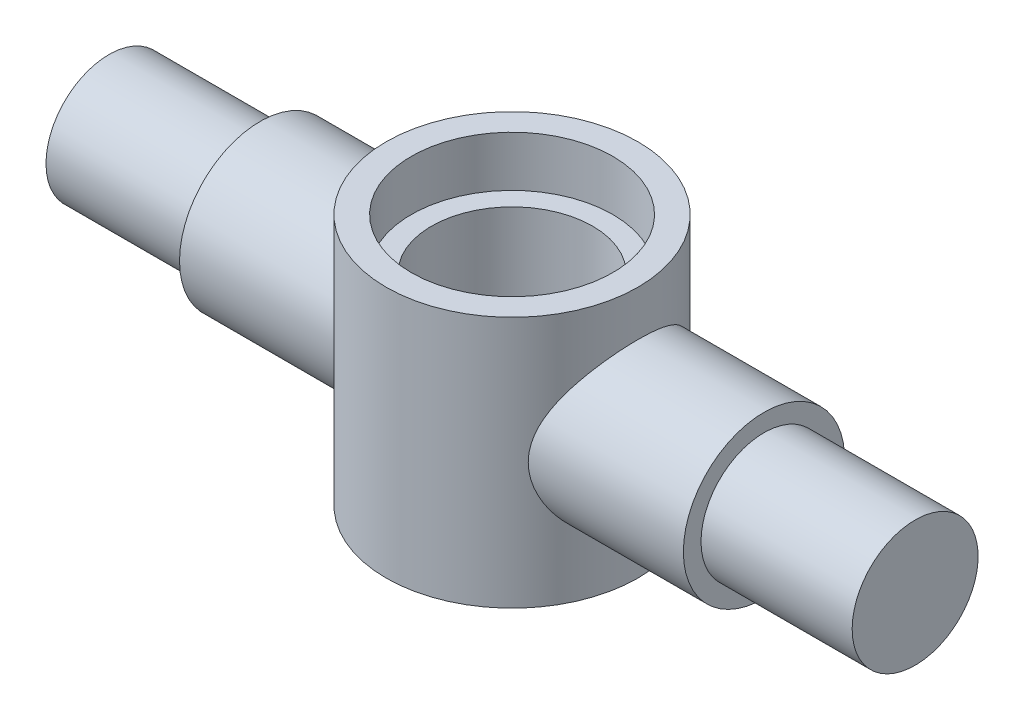
ISO-10303-21;
HEADER;
FILE_DESCRIPTION(('STEP AP214'),'2;1');
FILE_NAME('part.step','',(''),(''),'','','');
FILE_SCHEMA(('AUTOMOTIVE_DESIGN { 1 0 10303 214 1 1 1 1 }'));
ENDSEC;
DATA;
#1=APPLICATION_CONTEXT('core data for automotive mechanical design processes');
#2=APPLICATION_PROTOCOL_DEFINITION('international standard','automotive_design',2000,#1);
#3=PRODUCT_CONTEXT('',#1,'mechanical');
#4=PRODUCT('Part','Part','',(#3));
#5=PRODUCT_RELATED_PRODUCT_CATEGORY('part','',(#4));
#6=PRODUCT_DEFINITION_FORMATION('','',#4);
#7=PRODUCT_DEFINITION_CONTEXT('part definition',#1,'design');
#8=PRODUCT_DEFINITION('design','',#6,#7);
#9=PRODUCT_DEFINITION_SHAPE('','',#8);
#10=(LENGTH_UNIT() NAMED_UNIT(*) SI_UNIT(.MILLI.,.METRE.));
#11=(NAMED_UNIT(*) PLANE_ANGLE_UNIT() SI_UNIT($,.RADIAN.));
#12=(NAMED_UNIT(*) SI_UNIT($,.STERADIAN.) SOLID_ANGLE_UNIT());
#13=UNCERTAINTY_MEASURE_WITH_UNIT(LENGTH_MEASURE(1.E-05),#10,'distance_accuracy_value','');
#14=(GEOMETRIC_REPRESENTATION_CONTEXT(3) GLOBAL_UNCERTAINTY_ASSIGNED_CONTEXT((#13)) GLOBAL_UNIT_ASSIGNED_CONTEXT((#10,
#11,#12)) REPRESENTATION_CONTEXT('',''));
#15=CARTESIAN_POINT('',(0.,0.,0.));
#16=DIRECTION('',(0.,0.,1.));
#17=DIRECTION('',(1.,0.,0.));
#18=AXIS2_PLACEMENT_3D('',#15,#16,#17);
#19=CARTESIAN_POINT('',(0.,25.,0.));
#20=DIRECTION('',(0.,1.,0.));
#21=DIRECTION('',(-1.,0.,0.));
#22=AXIS2_PLACEMENT_3D('',#19,#20,#21);
#23=CYLINDRICAL_SURFACE('',#22,25.);
#24=CARTESIAN_POINT('',(0.,25.,0.));
#25=DIRECTION('',(0.,1.,0.));
#26=DIRECTION('',(-1.,0.,0.));
#27=AXIS2_PLACEMENT_3D('',#24,#25,#26);
#28=CIRCLE('',#27,25.);
#29=CARTESIAN_POINT('',(-25.,25.,0.));
#30=VERTEX_POINT('',#29);
#31=EDGE_CURVE('E57',#30,#30,#28,.T.);
#32=ORIENTED_EDGE('',*,*,#31,.F.);
#33=EDGE_LOOP('',(#32));
#34=FACE_BOUND('',#33,.T.);
#35=CARTESIAN_POINT('',(0.,-25.,0.));
#36=DIRECTION('',(0.,1.,0.));
#37=DIRECTION('',(-1.,0.,0.));
#38=AXIS2_PLACEMENT_3D('',#35,#36,#37);
#39=CIRCLE('',#38,25.);
#40=CARTESIAN_POINT('',(-25.,-25.,0.));
#41=VERTEX_POINT('',#40);
#42=EDGE_CURVE('E55',#41,#41,#39,.T.);
#43=ORIENTED_EDGE('',*,*,#42,.T.);
#44=EDGE_LOOP('',(#43));
#45=FACE_BOUND('',#44,.T.);
#46=CARTESIAN_POINT('',(19.2093727122986,0.,16.));
#47=CARTESIAN_POINT('',(19.2093602004703,-0.395450741818392,16.0000075518309));
#48=CARTESIAN_POINT('',(19.2216281701415,-0.790830022740218,15.985318558414));
#49=CARTESIAN_POINT('',(19.2700828129892,-1.57809681292205,15.9268763773465));
#50=CARTESIAN_POINT('',(19.3062771873145,-1.96998315674333,15.8831138318214));
#51=CARTESIAN_POINT('',(19.4010060093012,-2.74740735451356,15.7672610060305));
#52=CARTESIAN_POINT('',(19.4595765701312,-3.13293388953269,15.695124927821));
#53=CARTESIAN_POINT('',(19.5965538328848,-3.89425061412518,15.5237584274562));
#54=CARTESIAN_POINT('',(19.6749599547327,-4.27004108806787,15.424528797624));
#55=CARTESIAN_POINT('',(19.8478677138077,-5.00648391302579,15.2013768268568));
#56=CARTESIAN_POINT('',(19.9422183799563,-5.36724195350467,15.0776843957441));
#57=CARTESIAN_POINT('',(20.144463471884,-6.07574987096303,14.80639059605));
#58=CARTESIAN_POINT('',(20.2523599296603,-6.42349778612012,14.6587856393959));
#59=CARTESIAN_POINT('',(20.4786703313642,-7.10487336943405,14.34092425358));
#60=CARTESIAN_POINT('',(20.5970838421642,-7.43850161825142,14.1706687570999));
#61=CARTESIAN_POINT('',(20.8415708471704,-8.09089316911373,13.8085717175924));
#62=CARTESIAN_POINT('',(20.9676448352994,-8.40965551030582,13.6167287819958));
#63=CARTESIAN_POINT('',(21.2429784742916,-9.07571937888856,13.183726884198));
#64=CARTESIAN_POINT('',(21.3929937414825,-9.42067256852973,12.9394311786344));
#65=CARTESIAN_POINT('',(21.6958102059326,-10.089453664192,12.4250119334488));
#66=CARTESIAN_POINT('',(21.8486115820407,-10.4132802078776,12.1548867309956));
#67=CARTESIAN_POINT('',(22.153690243193,-11.0390522050632,11.5895322792664));
#68=CARTESIAN_POINT('',(22.3059669935383,-11.3409794346957,11.2942825562918));
#69=CARTESIAN_POINT('',(22.6066292638259,-11.9214646022861,10.6797634395583));
#70=CARTESIAN_POINT('',(22.7550145449759,-12.2000211084417,10.3604925764188));
#71=CARTESIAN_POINT('',(23.0635047016872,-12.7667075937182,9.65613685196289));
#72=CARTESIAN_POINT('',(23.2226498605155,-13.0514317810644,9.26787638476106));
#73=CARTESIAN_POINT('',(23.5277165227615,-13.5868256125372,8.46354327157017));
#74=CARTESIAN_POINT('',(23.6736365980179,-13.8374915802119,8.04746763026313));
#75=CARTESIAN_POINT('',(23.9479803876146,-14.3017764357153,7.19003859126285));
#76=CARTESIAN_POINT('',(24.0764176374088,-14.5154240190881,6.74870512893473));
#77=CARTESIAN_POINT('',(24.3119879120981,-14.9029000599008,5.84344355319202));
#78=CARTESIAN_POINT('',(24.4191250484791,-15.076736202989,5.37951982186268));
#79=CARTESIAN_POINT('',(24.5985926447152,-15.3656160862095,4.48282903672906));
#80=CARTESIAN_POINT('',(24.6734013192139,-15.4849249997567,4.05193075208175));
#81=CARTESIAN_POINT('',(24.801040881362,-15.6875056250082,3.17853043332121));
#82=CARTESIAN_POINT('',(24.8538731689283,-15.7707796321842,2.73602914024028));
#83=CARTESIAN_POINT('',(24.9359332327917,-15.8997874849552,1.84383752201983));
#84=CARTESIAN_POINT('',(24.9651830643106,-15.9455564074084,1.39415431610934));
#85=CARTESIAN_POINT('',(24.9992426632787,-15.9988302400714,0.491624497686972));
#86=CARTESIAN_POINT('',(25.0040554585505,-16.0063398907209,0.0387782840441615));
#87=CARTESIAN_POINT('',(24.9901621157745,-15.9846245464524,-0.801807020258263));
#88=CARTESIAN_POINT('',(24.9746698897481,-15.9604195679006,-1.18974170793274));
#89=CARTESIAN_POINT('',(24.925916743737,-15.8840233753194,-1.96167918510344));
#90=CARTESIAN_POINT('',(24.8926579243074,-15.8318354697257,-2.34568243394718));
#91=CARTESIAN_POINT('',(24.809124943467,-15.7001676417372,-3.10709482157081));
#92=CARTESIAN_POINT('',(24.7588500773314,-15.6206865889864,-3.48450368656139));
#93=CARTESIAN_POINT('',(24.6423835379047,-15.4354220324528,-4.23029490411503));
#94=CARTESIAN_POINT('',(24.5761911870475,-15.3296374089885,-4.59867687169073));
#95=CARTESIAN_POINT('',(24.429246979534,-15.09293595188,-5.3243786114757));
#96=CARTESIAN_POINT('',(24.3484911868781,-14.9620123234025,-5.68169536247057));
#97=CARTESIAN_POINT('',(24.1740178828328,-14.6763730310704,-6.38338290414123));
#98=CARTESIAN_POINT('',(24.0803005538868,-14.5216577020982,-6.72775387695178));
#99=CARTESIAN_POINT('',(23.88162522246,-14.1897742394937,-7.40213203498125));
#100=CARTESIAN_POINT('',(23.7766665635656,-14.0126047945902,-7.73213837982413));
#101=CARTESIAN_POINT('',(23.5573305378522,-13.6371200068658,-8.37663930224959));
#102=CARTESIAN_POINT('',(23.4429521112619,-13.4388022840152,-8.69113212810155));
#103=CARTESIAN_POINT('',(23.1916461498523,-12.9957628822917,-9.34261350029824));
#104=CARTESIAN_POINT('',(23.0537005367941,-12.7483470877916,-9.67737906939421));
#105=CARTESIAN_POINT('',(22.7710425195163,-12.2297848715424,-10.3249438913943));
#106=CARTESIAN_POINT('',(22.6263296265049,-11.9586367344007,-10.6377415534904));
#107=CARTESIAN_POINT('',(22.3328215884758,-11.3935639779315,-11.2408946521999));
#108=CARTESIAN_POINT('',(22.1840210043112,-11.0996079572823,-11.5312180082151));
#109=CARTESIAN_POINT('',(21.8855595984986,-10.4903882100913,-12.0880975088665));
#110=CARTESIAN_POINT('',(21.7358987343383,-10.1751234221084,-12.3546524680054));
#111=CARTESIAN_POINT('',(21.4181651432605,-9.47875337366145,-12.8986334479259));
#112=CARTESIAN_POINT('',(21.2504398360994,-9.09460175903956,-13.1723794101635));
#113=CARTESIAN_POINT('',(20.9231280377543,-8.30108239529781,-13.6863281692123));
#114=CARTESIAN_POINT('',(20.7635431930463,-7.89170958165702,-13.9265241972136));
#115=CARTESIAN_POINT('',(20.4583462502362,-7.04964812228662,-14.3711052241852));
#116=CARTESIAN_POINT('',(20.3127140688785,-6.61699443242505,-14.5755420556062));
#117=CARTESIAN_POINT('',(20.1091927064436,-5.95182141302221,-14.8537397354869));
#118=CARTESIAN_POINT('',(20.043847548657,-5.72742835996076,-14.9417198388729));
#119=CARTESIAN_POINT('',(19.9188677051514,-5.27341753747447,-15.107928903543));
#120=CARTESIAN_POINT('',(19.8592344402921,-5.04379848554791,-15.1861554400349));
#121=CARTESIAN_POINT('',(19.720753651965,-4.47386707312211,-15.3658713186935));
#122=CARTESIAN_POINT('',(19.645552574875,-4.13084777878346,-15.4616911152538));
#123=CARTESIAN_POINT('',(19.5113255727846,-3.43625908207936,-15.6307339070693));
#124=CARTESIAN_POINT('',(19.4522955441896,-3.08469187354872,-15.7039626356712));
#125=CARTESIAN_POINT('',(19.3524938058948,-2.37531516224826,-15.8267893922012));
#126=CARTESIAN_POINT('',(19.3116995928932,-2.01751392232936,-15.8764165497243));
#127=CARTESIAN_POINT('',(19.24981462822,-1.29766012634529,-15.9513955181358));
#128=CARTESIAN_POINT('',(19.2287241117882,-0.935607519575856,-15.9767470392006));
#129=CARTESIAN_POINT('',(19.2070655710884,-0.208914040156353,-16.0027787782538));
#130=CARTESIAN_POINT('',(19.2065587736387,0.155731327892919,-16.0033853918814));
#131=CARTESIAN_POINT('',(19.2262437044411,0.883646492477324,-15.9797303685735));
#132=CARTESIAN_POINT('',(19.2464355421881,1.2469162817255,-15.9554686000853));
#133=CARTESIAN_POINT('',(19.3067193481981,1.96956504405772,-15.8824686441804));
#134=CARTESIAN_POINT('',(19.3468257479805,2.32894100212412,-15.8337127062304));
#135=CARTESIAN_POINT('',(19.4454047345737,3.04108188334853,-15.7124891921192));
#136=CARTESIAN_POINT('',(19.5038777302889,3.39384665913328,-15.640021088041));
#137=CARTESIAN_POINT('',(19.6353070822549,4.08117003267904,-15.4746735603332));
#138=CARTESIAN_POINT('',(19.7078206333577,4.41596250211351,-15.3824106552207));
#139=CARTESIAN_POINT('',(19.8661366285732,5.07603904878438,-15.1773980264134));
#140=CARTESIAN_POINT('',(19.9519442856407,5.4013193363182,-15.0646402631501));
#141=CARTESIAN_POINT('',(20.2259366590945,6.36115702066662,-14.6970969552363));
#142=CARTESIAN_POINT('',(20.4307664709313,6.98008445692647,-14.4129501324544));
#143=CARTESIAN_POINT('',(20.7791231934689,7.92978311110474,-13.9025759153207));
#144=CARTESIAN_POINT('',(20.9141789774944,8.27634446914637,-13.6990065677717));
#145=CARTESIAN_POINT('',(21.1904755475319,8.95159599548267,-13.2676036626528));
#146=CARTESIAN_POINT('',(21.331716916245,9.28028447353068,-13.0397678161961));
#147=CARTESIAN_POINT('',(21.617328622136,9.91920804166725,-12.5606127955534));
#148=CARTESIAN_POINT('',(21.7617021658762,10.2294228728555,-12.3092685900815));
#149=CARTESIAN_POINT('',(22.0504950386983,10.83022156592,-11.7841200489597));
#150=CARTESIAN_POINT('',(22.1949143700021,11.1208042527167,-11.5103143710492));
#151=CARTESIAN_POINT('',(22.5068806894766,11.7320378290204,-10.8895251971102));
#152=CARTESIAN_POINT('',(22.6738912555057,12.0486339518646,-10.538258852383));
#153=CARTESIAN_POINT('',(22.9997454081353,12.6511856036189,-9.80673841828235));
#154=CARTESIAN_POINT('',(23.1585876314467,12.9371360263668,-9.42647951620011));
#155=CARTESIAN_POINT('',(23.4637861759484,13.4758482705846,-8.63879825507576));
#156=CARTESIAN_POINT('',(23.6101533508035,13.7286390473383,-8.23140006944533));
#157=CARTESIAN_POINT('',(23.8173475602848,14.0810166740321,-7.60150490333189));
#158=CARTESIAN_POINT('',(23.8843490627493,14.1940015577088,-7.38842079738172));
#159=CARTESIAN_POINT('',(24.0137961299491,14.4107587612229,-6.95618401063908));
#160=CARTESIAN_POINT('',(24.0762405186914,14.5145287045722,-6.73702978339917));
#161=CARTESIAN_POINT('',(24.2320055848663,14.7717973408357,-6.15995796925272));
#162=CARTESIAN_POINT('',(24.321400053688,14.9178236369807,-5.79759896313244));
#163=CARTESIAN_POINT('',(24.4854315282584,15.1837844441139,-5.06026412930272));
#164=CARTESIAN_POINT('',(24.5600711973214,15.3037236643405,-4.6852905929035));
#165=CARTESIAN_POINT('',(24.6929742121903,15.5161154342713,-3.92502403877744));
#166=CARTESIAN_POINT('',(24.7512476771231,15.6085849703694,-3.53973755962496));
#167=CARTESIAN_POINT('',(24.8501510392655,15.7649509257018,-2.76115486747052));
#168=CARTESIAN_POINT('',(24.8907806004012,15.8288468006774,-2.36785850204886));
#169=CARTESIAN_POINT('',(24.9535312925749,15.9273404409633,-1.57480221577731));
#170=CARTESIAN_POINT('',(24.9755905708137,15.9618403003625,-1.17502517982107));
#171=CARTESIAN_POINT('',(25.0004272981601,16.0006746513738,-0.373405625880842));
#172=CARTESIAN_POINT('',(25.0032047459269,16.0050091408883,0.0284368922467695));
#173=CARTESIAN_POINT('',(24.9894083698085,15.9834476229949,0.831001220465051));
#174=CARTESIAN_POINT('',(24.9728331376842,15.9575494156401,1.23172294687188));
#175=CARTESIAN_POINT('',(24.9207400616191,15.8759022758455,2.02885267808105));
#176=CARTESIAN_POINT('',(24.8852226810495,15.8201540736094,2.42526078816295));
#177=CARTESIAN_POINT('',(24.7984189745796,15.68324665588,3.19044626417198));
#178=CARTESIAN_POINT('',(24.7480444224836,15.6035527406556,3.55959149260969));
#179=CARTESIAN_POINT('',(24.6320994030311,15.4189971904594,4.28906417390255));
#180=CARTESIAN_POINT('',(24.5665295814812,15.3141366250765,4.64939200078243));
#181=CARTESIAN_POINT('',(24.4214925565386,15.0803746063925,5.35928858254075));
#182=CARTESIAN_POINT('',(24.3420245415617,14.9514717491141,5.70885670770437));
#183=CARTESIAN_POINT('',(24.170683642612,14.6708653525123,6.39556994704414));
#184=CARTESIAN_POINT('',(24.0788100748657,14.5191605563319,6.73271437514203));
#185=CARTESIAN_POINT('',(23.8769190367743,14.1819204834617,7.41821218958759));
#186=CARTESIAN_POINT('',(23.7660547293117,13.9946940329281,7.76548374262893));
#187=CARTESIAN_POINT('',(23.533987358231,13.5968623110591,8.44272462594597));
#188=CARTESIAN_POINT('',(23.4127838763452,13.3862560937994,8.77269325536516));
#189=CARTESIAN_POINT('',(23.1621773907135,12.942948547228,9.41447208281313));
#190=CARTESIAN_POINT('',(23.0327692434887,12.7102333113594,9.72627065030755));
#191=CARTESIAN_POINT('',(22.7681033449974,12.224078988506,10.3306501038477));
#192=CARTESIAN_POINT('',(22.6328450147247,11.9706378480088,10.6232290804345));
#193=CARTESIAN_POINT('',(22.3378986081481,11.4038990021542,11.2316218874087));
#194=CARTESIAN_POINT('',(22.1776354019021,11.0873722519175,11.5441559130474));
#195=CARTESIAN_POINT('',(21.8562350326654,10.4296383547697,12.1416680025961));
#196=CARTESIAN_POINT('',(21.6950977427163,10.0884275286712,12.4266419437925));
#197=CARTESIAN_POINT('',(21.375928274595,9.38240404588212,12.9679779160604));
#198=CARTESIAN_POINT('',(21.2178973024897,9.01758244911156,13.2243290079454));
#199=CARTESIAN_POINT('',(20.9093760040417,8.26556414666312,13.7069324509098));
#200=CARTESIAN_POINT('',(20.7588843294594,7.87837146842733,13.933190195594));
#201=CARTESIAN_POINT('',(20.4904053646846,7.13850609897017,14.3245055255624));
#202=CARTESIAN_POINT('',(20.3708181994352,6.78859802866814,14.4936962326903));
#203=CARTESIAN_POINT('',(20.1439415106924,6.07397381223701,14.8074000887338));
#204=CARTESIAN_POINT('',(20.0366521382654,5.70925748427749,14.9519129345167));
#205=CARTESIAN_POINT('',(19.837970972326,4.96714496507767,15.2145325262258));
#206=CARTESIAN_POINT('',(19.7465442856356,4.58977884054347,15.3326973975323));
#207=CARTESIAN_POINT('',(19.5826454523432,3.82361318584246,15.5414800751121));
#208=CARTESIAN_POINT('',(19.5101663424499,3.43481791452257,15.6321080032873));
#209=CARTESIAN_POINT('',(19.3709744142914,2.54459093114954,15.8044576067829));
#210=CARTESIAN_POINT('',(19.3107841815136,2.04041323215055,15.8775776488039));
#211=CARTESIAN_POINT('',(19.2299909394771,1.02411722304983,15.9753445575078));
#212=CARTESIAN_POINT('',(19.209388911636,0.51199871640755,15.9999902224795));
#213=CARTESIAN_POINT('',(19.2093727122986,0.,16.));
#214=B_SPLINE_CURVE_WITH_KNOTS('',3,(#46,#47,#48,#49,#50,#51,#52,#53,#54,#55,#56,#57,#58,#59,
#60,#61,#62,#63,#64,#65,#66,#67,#68,#69,#70,#71,#72,#73,#74,#75,#76,#77,#78,#79,#80,#81,#82,#83,
#84,#85,#86,#87,#88,#89,#90,#91,#92,#93,#94,#95,#96,#97,#98,#99,#100,#101,#102,#103,#104,#105,
#106,#107,#108,#109,#110,#111,#112,#113,#114,#115,#116,#117,#118,#119,#120,#121,#122,#123,#124,
#125,#126,#127,#128,#129,#130,#131,#132,#133,#134,#135,#136,#137,#138,#139,#140,#141,#142,#143,
#144,#145,#146,#147,#148,#149,#150,#151,#152,#153,#154,#155,#156,#157,#158,#159,#160,#161,#162,
#163,#164,#165,#166,#167,#168,#169,#170,#171,#172,#173,#174,#175,#176,#177,#178,#179,#180,#181,
#182,#183,#184,#185,#186,#187,#188,#189,#190,#191,#192,#193,#194,#195,#196,#197,#198,#199,#200,
#201,#202,#203,#204,#205,#206,#207,#208,#209,#210,#211,#212,#213),.UNSPECIFIED.,.T.,.F.,(4,2,2,
2,2,2,2,2,2,2,2,2,2,2,2,2,2,2,2,2,2,2,2,2,2,2,2,2,2,2,2,2,2,2,2,2,2,2,2,2,2,2,2,2,2,2,2,2,2,2,2,
2,2,2,2,2,2,2,2,2,2,2,2,2,2,2,2,2,2,2,2,2,2,2,2,2,2,2,2,2,2,2,2,4),(0.,1.18577451563378,
2.3719308803307,3.56000973844409,4.74805385612807,5.92542182765323,7.10296662705879,
8.28046295368245,9.45803528219828,10.8023160446125,12.1466834064257,13.4921569662333,
14.8377128960858,16.3569602143826,17.876371399424,19.3945994612359,20.9125341796885,
22.2705040937009,23.6283874904698,24.9849994644068,26.3414433459186,27.5070310105171,
28.6724808974645,29.8379790577811,31.0035268391193,32.1693901015006,33.3352369551525,
34.5011519231031,35.6671982420161,36.981484304163,38.2958654425361,39.6120894425729,
40.9283790552946,42.4284846788318,43.9288925178197,45.4271071822749,46.1760210388417,
46.9251207099888,48.0159853843354,49.1065729819124,50.1958110356673,51.2850620935235,
52.3775529210133,53.4700495277667,54.5633389938717,55.6566528021364,56.7198824116749,
57.783530000594,59.909660789382,61.1808078676574,62.4520749505808,63.7247114101544,
64.9974239758646,66.5001130296407,68.0030520722832,69.5046698733184,70.2553847672214,
71.0062927079441,72.2072677819863,73.408025875761,74.6080399052386,75.8080767910933,
77.0120950499147,78.2161133924544,79.4202193534208,80.6242958603644,81.766023444616,
82.9077025137561,84.0494482734539,85.1912569899845,86.4194532766275,87.6476992731069,
88.8767230159271,90.105868677688,91.5228092826638,92.9399615210125,94.357653531239,
95.7750911063543,96.9939255712751,98.2127750067778,99.4289083750166,100.644594180297,
102.179804297619,103.715052473312),.UNSPECIFIED.);
#215=CARTESIAN_POINT('',(19.2093727122986,0.,16.));
#216=VERTEX_POINT('',#215);
#217=EDGE_CURVE('E48',#216,#216,#214,.T.);
#218=ORIENTED_EDGE('',*,*,#217,.F.);
#219=EDGE_LOOP('',(#218));
#220=FACE_BOUND('',#219,.T.);
#221=CARTESIAN_POINT('',(-25.,-16.,0.));
#222=CARTESIAN_POINT('',(-25.0000015619882,-16.0000018773157,0.404925044071176));
#223=CARTESIAN_POINT('',(-24.990142097665,-15.9846099706385,0.809832411815946));
#224=CARTESIAN_POINT('',(-24.9509510419688,-15.92326968288,1.61652618236302));
#225=CARTESIAN_POINT('',(-24.9216122625561,-15.8773100220158,2.01831137766447));
#226=CARTESIAN_POINT('',(-24.8441286420605,-15.7554098701401,2.81604821037115));
#227=CARTESIAN_POINT('',(-24.7959565811092,-15.6794259832054,3.2119905395922));
#228=CARTESIAN_POINT('',(-24.6819740036757,-15.4985408355827,3.99456099671031));
#229=CARTESIAN_POINT('',(-24.6161648797958,-15.3936418579784,4.38118985736236));
#230=CARTESIAN_POINT('',(-24.468785547579,-15.1568468243231,5.1407660907412));
#231=CARTESIAN_POINT('',(-24.3872961899422,-15.025089059471,5.51377244407855));
#232=CARTESIAN_POINT('',(-24.2100855842812,-14.7357159583602,6.24609510158278));
#233=CARTESIAN_POINT('',(-24.114364104839,-14.5781002016396,6.60541118302289));
#234=CARTESIAN_POINT('',(-23.9106324755014,-14.2385667901493,7.30859986653981));
#235=CARTESIAN_POINT('',(-23.8026253610819,-14.0566551363675,7.65247625422318));
#236=CARTESIAN_POINT('',(-23.5763254629354,-13.6699562899151,8.32360019852908));
#237=CARTESIAN_POINT('',(-23.4580313681202,-13.4651661804077,8.65084562706961));
#238=CARTESIAN_POINT('',(-23.2032751229575,-13.0164828623738,9.31365412183655));
#239=CARTESIAN_POINT('',(-23.0661182340287,-12.7707619235136,9.64771274316308));
#240=CARTESIAN_POINT('',(-22.7850064089794,-12.2557366535805,10.2940617258667));
#241=CARTESIAN_POINT('',(-22.6410511668713,-11.9864312605261,10.6063511058609));
#242=CARTESIAN_POINT('',(-22.3490022897849,-11.4252092234652,11.2086687230747));
#243=CARTESIAN_POINT('',(-22.2009034973146,-11.1332635184821,11.4986673651025));
#244=CARTESIAN_POINT('',(-21.9037344054836,-10.5282019106555,12.0551203444099));
#245=CARTESIAN_POINT('',(-21.7546640715094,-10.2150852497817,12.3215738378621));
#246=CARTESIAN_POINT('',(-21.4374499122155,-9.52219977657806,12.8665793254927));
#247=CARTESIAN_POINT('',(-21.2696389657507,-9.1393143835168,13.1413799496497));
#248=CARTESIAN_POINT('',(-20.9419379170098,-8.348316185452,13.6575524379486));
#249=CARTESIAN_POINT('',(-20.7820494133894,-7.94019832587866,13.8989175727052));
#250=CARTESIAN_POINT('',(-20.4759821659353,-7.10058524689527,14.3459904698911));
#251=CARTESIAN_POINT('',(-20.3297848843603,-6.66912292284908,14.5517467761611));
#252=CARTESIAN_POINT('',(-20.1252100289451,-6.00569055390515,14.8320367864773));
#253=CARTESIAN_POINT('',(-20.0594794225192,-5.78186975362471,14.9207331379766));
#254=CARTESIAN_POINT('',(-19.9336577942813,-5.3289818989008,15.0884150598226));
#255=CARTESIAN_POINT('',(-19.8735682005867,-5.09991353411016,15.16739817266));
#256=CARTESIAN_POINT('',(-19.7336948385013,-4.53055229253545,15.3492623867947));
#257=CARTESIAN_POINT('',(-19.6575477076493,-4.18751389202039,15.4464497728831));
#258=CARTESIAN_POINT('',(-19.521358473509,-3.49276536899716,15.6182136002394));
#259=CARTESIAN_POINT('',(-19.4613122707708,-3.14105747877334,15.6927957976356));
#260=CARTESIAN_POINT('',(-19.3594402998739,-2.43126972701605,15.8183001813279));
#261=CARTESIAN_POINT('',(-19.3175916839816,-2.07319844663943,15.8692520417559));
#262=CARTESIAN_POINT('',(-19.2535956523238,-1.35265801288986,15.9468367737907));
#263=CARTESIAN_POINT('',(-19.231448454688,-0.990188810869151,15.9734693761403));
#264=CARTESIAN_POINT('',(-19.2077129340946,-0.262460156150678,16.0020035959886));
#265=CARTESIAN_POINT('',(-19.2061890356969,0.102804475372161,16.0038277150333));
#266=CARTESIAN_POINT('',(-19.2239297577434,0.832091460399474,15.9825126443981));
#267=CARTESIAN_POINT('',(-19.24319448145,1.19611380772419,15.9593733307184));
#268=CARTESIAN_POINT('',(-19.3017467127909,1.92037328223285,15.8885074198919));
#269=CARTESIAN_POINT('',(-19.3410485617405,2.28060750937627,15.8407632118421));
#270=CARTESIAN_POINT('',(-19.4381624474468,2.99454239108447,15.7214419318028));
#271=CARTESIAN_POINT('',(-19.4959748739967,3.34824290789736,15.6498643579324));
#272=CARTESIAN_POINT('',(-19.6260739031015,4.03652558609995,15.4863735674023));
#273=CARTESIAN_POINT('',(-19.6978709558272,4.37136256989055,15.3951393603923));
#274=CARTESIAN_POINT('',(-19.8548252831694,5.03160397521626,15.1921818732878));
#275=CARTESIAN_POINT('',(-19.9399877947337,5.35700463988336,15.0804505589621));
#276=CARTESIAN_POINT('',(-20.2121658403417,6.31729900859783,14.7159808896165));
#277=CARTESIAN_POINT('',(-20.415946958597,6.93665942019117,14.4338764142666));
#278=CARTESIAN_POINT('',(-20.7627220180091,7.88670986628182,13.9270311591719));
#279=CARTESIAN_POINT('',(-20.8971209302017,8.23315173665737,13.7249831568112));
#280=CARTESIAN_POINT('',(-21.1722128751606,8.90828480780035,13.2966961611891));
#281=CARTESIAN_POINT('',(-21.3129064950318,9.23697434647771,13.0704549086854));
#282=CARTESIAN_POINT('',(-21.5975435918726,9.87602455074263,12.5945655171766));
#283=CARTESIAN_POINT('',(-21.741490387645,10.1863652117508,12.3448925721126));
#284=CARTESIAN_POINT('',(-22.0295648350163,10.7875537186817,11.823159163581));
#285=CARTESIAN_POINT('',(-22.1736924970079,11.0784003868203,11.5510973496357));
#286=CARTESIAN_POINT('',(-22.4854503237815,11.6908990129197,10.9336594778248));
#287=CARTESIAN_POINT('',(-22.6525676241315,12.0084814733917,10.5839664649273));
#288=CARTESIAN_POINT('',(-22.9788334546104,12.6131505683738,9.85558430354048));
#289=CARTESIAN_POINT('',(-23.1379806516688,12.9002321102804,9.47689033099586));
#290=CARTESIAN_POINT('',(-23.4439951491246,13.4413788795508,8.69230147452352));
#291=CARTESIAN_POINT('',(-23.5908728474814,13.695472166599,8.28643015897212));
#292=CARTESIAN_POINT('',(-23.7989867549893,14.0499422909588,7.65877791158846));
#293=CARTESIAN_POINT('',(-23.8663204968941,14.1636478233454,7.44643333273029));
#294=CARTESIAN_POINT('',(-23.9964832307619,14.3818943973732,7.01565570471914));
#295=CARTESIAN_POINT('',(-24.0593110591769,14.4864330734262,6.79722110303669));
#296=CARTESIAN_POINT('',(-24.2163596379815,14.7461292462035,6.22117702909599));
#297=CARTESIAN_POINT('',(-24.3066645830134,14.8937970331853,5.85907262264254));
#298=CARTESIAN_POINT('',(-24.472571043401,15.1630462524395,5.12210088957015));
#299=CARTESIAN_POINT('',(-24.5481752064179,15.2846323825156,4.74723587549782));
#300=CARTESIAN_POINT('',(-24.6830408717459,15.5003093339703,3.98702789616477));
#301=CARTESIAN_POINT('',(-24.7423124565402,15.5944171205238,3.60169155725473));
#302=CARTESIAN_POINT('',(-24.8432233011495,15.7540335011103,2.82284294906274));
#303=CARTESIAN_POINT('',(-24.8848622338729,15.8195415646094,2.42933052825375));
#304=CARTESIAN_POINT('',(-24.9496239299749,15.9212210484698,1.63564062619808));
#305=CARTESIAN_POINT('',(-24.9726833167174,15.9572920615261,1.23544504541875));
#306=CARTESIAN_POINT('',(-24.999477761314,15.9991921444795,0.432822676299686));
#307=CARTESIAN_POINT('',(-25.003212815007,16.0050212078647,0.0303958874795171));
#308=CARTESIAN_POINT('',(-24.9912650807508,15.9863498172394,-0.773483996299107));
#309=CARTESIAN_POINT('',(-24.9755811323802,15.9618475507195,-1.17493703163256));
#310=CARTESIAN_POINT('',(-24.9251836971058,15.8828746268655,-1.97366097901497));
#311=CARTESIAN_POINT('',(-24.8904707030591,15.8284047457,-2.37093199910755));
#312=CARTESIAN_POINT('',(-24.8052000041332,15.6939634497678,-3.13731209509081));
#313=CARTESIAN_POINT('',(-24.7555850388601,15.6155053701039,-3.50679388900719));
#314=CARTESIAN_POINT('',(-24.6411050211604,15.4333752681049,-4.23704308721495));
#315=CARTESIAN_POINT('',(-24.576240633445,15.3297043447724,-4.59781087058803));
#316=CARTESIAN_POINT('',(-24.4325489543541,15.098267274378,-5.30867908099266));
#317=CARTESIAN_POINT('',(-24.3537207449646,14.9704995431003,-5.65877880490657));
#318=CARTESIAN_POINT('',(-24.1835862363121,14.6921060234087,-6.3466296016523));
#319=CARTESIAN_POINT('',(-24.092279251275,14.5414789787058,-6.68437999452993));
#320=CARTESIAN_POINT('',(-23.8916275742826,14.2066584791477,-7.37070229752058));
#321=CARTESIAN_POINT('',(-23.7814473707268,14.0208041517277,-7.71821923165124));
#322=CARTESIAN_POINT('',(-23.5506783083945,13.6257168103069,-8.3960563865157));
#323=CARTESIAN_POINT('',(-23.430089041497,13.4164828795388,-8.72637593215575));
#324=CARTESIAN_POINT('',(-23.180630204464,12.9759241468037,-9.36895085200483));
#325=CARTESIAN_POINT('',(-23.0517555610962,12.7445857670566,-9.68119493171719));
#326=CARTESIAN_POINT('',(-22.7880601838735,12.2611877169459,-10.2865613887257));
#327=CARTESIAN_POINT('',(-22.6532388486398,12.0091259486241,-10.579681824615));
#328=CARTESIAN_POINT('',(-22.3591293702995,11.4453931745428,-11.1893099340712));
#329=CARTESIAN_POINT('',(-22.1992483653671,11.1304967694322,-11.5025558397825));
#330=CARTESIAN_POINT('',(-21.8784405932856,10.4760453865055,-12.1016246389837));
#331=CARTESIAN_POINT('',(-21.7175136803215,10.1364869002433,-12.3874436172205));
#332=CARTESIAN_POINT('',(-21.3985808420018,9.43383774878561,-12.9305814468634));
#333=CARTESIAN_POINT('',(-21.2405756556402,9.07074123197174,-13.1878931678842));
#334=CARTESIAN_POINT('',(-20.9318561584343,8.32218851305902,-13.6725981697187));
#335=CARTESIAN_POINT('',(-20.7811407458473,7.93673570927365,-13.8999959805734));
#336=CARTESIAN_POINT('',(-20.5114248571981,7.19860411557443,-14.2944225726149));
#337=CARTESIAN_POINT('',(-20.3909016210024,6.84861937048303,-14.4654551193313));
#338=CARTESIAN_POINT('',(-20.1620574047654,6.13377200246868,-14.7827501975162));
#339=CARTESIAN_POINT('',(-20.0537340572626,5.76891228490502,-14.9290175376039));
#340=CARTESIAN_POINT('',(-19.8527690015487,5.02594698508985,-15.1952420148147));
#341=CARTESIAN_POINT('',(-19.7601104179272,4.64785619353895,-15.315227506719));
#342=CARTESIAN_POINT('',(-19.5936975313565,3.87987504664824,-15.5275641940392));
#343=CARTESIAN_POINT('',(-19.5199429946438,3.4899848372842,-15.6199157311731));
#344=CARTESIAN_POINT('',(-19.3938056687495,2.69708614747012,-15.7762650376));
#345=CARTESIAN_POINT('',(-19.3416363723446,2.29398728836183,-15.8399800811272));
#346=CARTESIAN_POINT('',(-19.2621898317534,1.48164477784622,-15.9364986807434));
#347=CARTESIAN_POINT('',(-19.2349119436678,1.0724012856687,-15.9693030364411));
#348=CARTESIAN_POINT('',(-19.2066524645509,0.251937882014708,-16.0032809353728));
#349=CARTESIAN_POINT('',(-19.2056547442586,-0.15928066225952,-16.004473879882));
#350=CARTESIAN_POINT('',(-19.2299728056356,-0.979782619212479,-15.9752468012828));
#351=CARTESIAN_POINT('',(-19.2552864904598,-1.38906618348532,-15.9448292973182));
#352=CARTESIAN_POINT('',(-19.3254345723058,-2.14298597707889,-15.8596997261338));
#353=CARTESIAN_POINT('',(-19.3669198547315,-2.48841817165343,-15.8091331210736));
#354=CARTESIAN_POINT('',(-19.4667172401765,-3.17297476292449,-15.6860828655746));
#355=CARTESIAN_POINT('',(-19.5250341268026,-3.51209733719601,-15.6135929841754));
#356=CARTESIAN_POINT('',(-19.6566579347328,-4.18238074207573,-15.4475564981701));
#357=CARTESIAN_POINT('',(-19.7299743789902,-4.51353636459322,-15.3539965127064));
#358=CARTESIAN_POINT('',(-19.8894647238651,-5.16633733479859,-15.1468238889593));
#359=CARTESIAN_POINT('',(-19.9756403612109,-5.48798139083823,-15.0332085416725));
#360=CARTESIAN_POINT('',(-20.1902486625657,-6.2299347962595,-14.7443693949179));
#361=CARTESIAN_POINT('',(-20.3230031980176,-6.64600179716923,-14.5614134998204));
#362=CARTESIAN_POINT('',(-20.6025569184015,-7.45724147650319,-14.1631148541737));
#363=CARTESIAN_POINT('',(-20.7493557588791,-7.85241466700576,-13.9477728978596));
#364=CARTESIAN_POINT('',(-21.0523136209136,-8.62118734138438,-13.4861556789325));
#365=CARTESIAN_POINT('',(-21.2084841630588,-8.99475911587268,-13.239841918056));
#366=CARTESIAN_POINT('',(-21.5254932104697,-9.71868049711563,-12.7179541719606));
#367=CARTESIAN_POINT('',(-21.6863313712946,-10.0690318111599,-12.442382341833));
#368=CARTESIAN_POINT('',(-22.010442238798,-10.7494224070127,-11.8597161505609));
#369=CARTESIAN_POINT('',(-22.1737212606611,-11.0791728601149,-11.5522878757903));
#370=CARTESIAN_POINT('',(-22.4968024507648,-11.7123977011906,-10.9097759508097));
#371=CARTESIAN_POINT('',(-22.6566045458943,-12.0158715370322,-10.5746917197737));
#372=CARTESIAN_POINT('',(-22.9689581645052,-12.5949385398338,-9.87788824812155));
#373=CARTESIAN_POINT('',(-23.1215088222784,-12.8705283822917,-9.51616584039962));
#374=CARTESIAN_POINT('',(-23.3420621846538,-13.2613498914431,-8.95480859407567));
#375=CARTESIAN_POINT('',(-23.4142021245946,-13.3878647497722,-8.76455786261007));
#376=CARTESIAN_POINT('',(-23.5553237080331,-13.6331707030461,-8.37789362684303));
#377=CARTESIAN_POINT('',(-23.6243041595969,-13.7519588900481,-8.18147784307569));
#378=CARTESIAN_POINT('',(-23.8300744697518,-14.1035237172432,-7.57072389698189));
#379=CARTESIAN_POINT('',(-23.9609814020929,-14.323210508379,-7.14672497942355));
#380=CARTESIAN_POINT('',(-24.2035792788676,-14.7254539287129,-6.27620668494683));
#381=CARTESIAN_POINT('',(-24.3152735453922,-14.9080169780295,-5.82969121870037));
#382=CARTESIAN_POINT('',(-24.4657106327018,-15.1517335983943,-5.14619804504744));
#383=CARTESIAN_POINT('',(-24.5129636821996,-15.2278849584961,-4.91633650685713));
#384=CARTESIAN_POINT('',(-24.6014604241758,-15.3699361290149,-4.45240645515483));
#385=CARTESIAN_POINT('',(-24.6427057539856,-15.4358387329389,-4.21833910749463));
#386=CARTESIAN_POINT('',(-24.756860888756,-15.6176557338748,-3.51078593222693));
#387=CARTESIAN_POINT('',(-24.8202802251292,-15.7178247777842,-3.03154239159495));
#388=CARTESIAN_POINT('',(-24.912855714342,-15.8635762871447,-2.12784973800437));
#389=CARTESIAN_POINT('',(-24.9454536896083,-15.9146575501143,-1.70461817648607));
#390=CARTESIAN_POINT('',(-24.989025253133,-15.982868800304,-0.854251246410917));
#391=CARTESIAN_POINT('',(-24.9999983524116,-15.9999980198034,-0.42711578979892));
#392=CARTESIAN_POINT('',(-25.,-16.,0.));
#393=B_SPLINE_CURVE_WITH_KNOTS('',3,(#221,#222,#223,#224,#225,#226,#227,#228,#229,#230,#231,
#232,#233,#234,#235,#236,#237,#238,#239,#240,#241,#242,#243,#244,#245,#246,#247,#248,#249,#250,
#251,#252,#253,#254,#255,#256,#257,#258,#259,#260,#261,#262,#263,#264,#265,#266,#267,#268,#269,
#270,#271,#272,#273,#274,#275,#276,#277,#278,#279,#280,#281,#282,#283,#284,#285,#286,#287,#288,
#289,#290,#291,#292,#293,#294,#295,#296,#297,#298,#299,#300,#301,#302,#303,#304,#305,#306,#307,
#308,#309,#310,#311,#312,#313,#314,#315,#316,#317,#318,#319,#320,#321,#322,#323,#324,#325,#326,
#327,#328,#329,#330,#331,#332,#333,#334,#335,#336,#337,#338,#339,#340,#341,#342,#343,#344,#345,
#346,#347,#348,#349,#350,#351,#352,#353,#354,#355,#356,#357,#358,#359,#360,#361,#362,#363,#364,
#365,#366,#367,#368,#369,#370,#371,#372,#373,#374,#375,#376,#377,#378,#379,#380,#381,#382,#383,
#384,#385,#386,#387,#388,#389,#390,#391,#392),.UNSPECIFIED.,.T.,.F.,(4,2,2,2,2,2,2,2,2,2,2,2,2,
2,2,2,2,2,2,2,2,2,2,2,2,2,2,2,2,2,2,2,2,2,2,2,2,2,2,2,2,2,2,2,2,2,2,2,2,2,2,2,2,2,2,2,2,2,2,2,2,
2,2,2,2,2,2,2,2,2,2,2,2,2,2,2,2,2,2,2,2,2,2,2,2,4),(0.,1.2143359037291,2.42912015739384,
3.64566667645103,4.86211716668029,6.07245576879059,7.28281405347461,8.49287393554705,
9.70308826789616,11.0121682302353,12.3213071693168,13.6321552474755,14.9430502856901,
16.4420715483407,17.9413940741466,19.4386562617971,20.1870950354631,20.9357227808739,
22.0283192451477,23.1206372592161,24.2115798402962,25.3025344998955,26.3968963790282,
27.4912636941612,28.5864153906037,29.6815901501144,30.7437087697947,31.8062446000701,
33.9301496941282,35.1981954835546,36.4663597906896,37.7358821242905,39.0054810906213,
40.5068568446586,42.0084828841258,43.5088231589307,44.258900518937,45.0091708768569,
46.2118707177269,47.4143537471899,48.6160927841587,49.8178541128161,51.0236976145029,
52.2295413758452,53.4354571982781,54.6413417886698,55.7829773658005,56.9245631890967,
58.0662240907687,59.2079477579223,60.4343408374661,61.6607820235585,62.8879814611388,
64.1153052891324,65.5300085169597,66.9449133972259,68.3601713857365,69.775214806001,
70.997381541078,72.2193106972438,73.4399149816459,74.6605041715842,75.8928927793549,
77.1252495063834,78.3568498658441,79.5883520824207,80.6419106900125,81.6957690183668,
82.7502985106615,83.8049705540183,85.2234889733917,86.6419726107123,88.0622371979518,
89.4823972438031,90.9193332530907,92.3562994483688,93.7934367662636,94.5120249362064,
95.2308820013993,96.7140532599454,98.1969678027554,98.9368252382388,99.6764806557274,
101.154474230587,102.435329338598,103.716213408864),.UNSPECIFIED.);
#394=CARTESIAN_POINT('',(-25.,-16.,0.));
#395=VERTEX_POINT('',#394);
#396=EDGE_CURVE('E10',#395,#395,#393,.T.);
#397=ORIENTED_EDGE('',*,*,#396,.F.);
#398=EDGE_LOOP('',(#397));
#399=FACE_BOUND('',#398,.T.);
#400=ADVANCED_FACE('F40',(#34,#45,#220,#399),#23,.T.);
#401=CARTESIAN_POINT('',(0.,-25.,0.));
#402=DIRECTION('',(0.,1.,0.));
#403=DIRECTION('',(-1.,0.,0.));
#404=AXIS2_PLACEMENT_3D('',#401,#402,#403);
#405=PLANE('',#404);
#406=CARTESIAN_POINT('',(0.,-25.,0.));
#407=DIRECTION('',(0.,-1.,0.));
#408=DIRECTION('',(0.,0.,-1.));
#409=AXIS2_PLACEMENT_3D('',#406,#407,#408);
#410=CIRCLE('',#409,16.);
#411=CARTESIAN_POINT('',(0.,-25.,-16.));
#412=VERTEX_POINT('',#411);
#413=EDGE_CURVE('E134',#412,#412,#410,.T.);
#414=ORIENTED_EDGE('',*,*,#413,.F.);
#415=EDGE_LOOP('',(#414));
#416=FACE_BOUND('',#415,.T.);
#417=ORIENTED_EDGE('',*,*,#42,.F.);
#418=EDGE_LOOP('',(#417));
#419=FACE_BOUND('',#418,.T.);
#420=ADVANCED_FACE('F39',(#416,#419),#405,.F.);
#421=CARTESIAN_POINT('',(25.,25.,0.));
#422=DIRECTION('',(0.,-1.,0.));
#423=DIRECTION('',(1.,0.,0.));
#424=AXIS2_PLACEMENT_3D('',#421,#422,#423);
#425=PLANE('',#424);
#426=CARTESIAN_POINT('',(0.,25.,0.));
#427=DIRECTION('',(0.,-1.,0.));
#428=DIRECTION('',(0.,0.,-1.));
#429=AXIS2_PLACEMENT_3D('',#426,#427,#428);
#430=CIRCLE('',#429,20.);
#431=CARTESIAN_POINT('',(0.,25.,-20.));
#432=VERTEX_POINT('',#431);
#433=EDGE_CURVE('E123',#432,#432,#430,.T.);
#434=ORIENTED_EDGE('',*,*,#433,.T.);
#435=EDGE_LOOP('',(#434));
#436=FACE_BOUND('',#435,.T.);
#437=ORIENTED_EDGE('',*,*,#31,.T.);
#438=EDGE_LOOP('',(#437));
#439=FACE_BOUND('',#438,.T.);
#440=ADVANCED_FACE('F81',(#436,#439),#425,.F.);
#441=CARTESIAN_POINT('',(80.,0.,0.));
#442=DIRECTION('',(-1.,0.,0.));
#443=DIRECTION('',(0.,0.,1.));
#444=AXIS2_PLACEMENT_3D('',#441,#442,#443);
#445=PLANE('',#444);
#446=CARTESIAN_POINT('',(80.,0.,0.));
#447=DIRECTION('',(-1.,0.,0.));
#448=DIRECTION('',(0.,0.,1.));
#449=AXIS2_PLACEMENT_3D('',#446,#447,#448);
#450=CIRCLE('',#449,12.5);
#451=CARTESIAN_POINT('',(80.,0.,12.5));
#452=VERTEX_POINT('',#451);
#453=EDGE_CURVE('E106',#452,#452,#450,.T.);
#454=ORIENTED_EDGE('',*,*,#453,.F.);
#455=EDGE_LOOP('',(#454));
#456=FACE_BOUND('',#455,.T.);
#457=ADVANCED_FACE('F82',(#456),#445,.F.);
#458=CARTESIAN_POINT('',(-80.,0.,0.));
#459=DIRECTION('',(-1.,0.,0.));
#460=DIRECTION('',(0.,0.,1.));
#461=AXIS2_PLACEMENT_3D('',#458,#459,#460);
#462=CYLINDRICAL_SURFACE('',#461,12.5);
#463=CARTESIAN_POINT('',(50.,0.,0.));
#464=DIRECTION('',(-1.,0.,0.));
#465=DIRECTION('',(0.,0.,1.));
#466=AXIS2_PLACEMENT_3D('',#463,#464,#465);
#467=CIRCLE('',#466,12.5);
#468=CARTESIAN_POINT('',(50.,0.,12.5));
#469=VERTEX_POINT('',#468);
#470=EDGE_CURVE('E107',#469,#469,#467,.T.);
#471=ORIENTED_EDGE('',*,*,#470,.F.);
#472=EDGE_LOOP('',(#471));
#473=FACE_BOUND('',#472,.T.);
#474=ORIENTED_EDGE('',*,*,#453,.T.);
#475=EDGE_LOOP('',(#474));
#476=FACE_BOUND('',#475,.T.);
#477=ADVANCED_FACE('F80',(#473,#476),#462,.T.);
#478=CARTESIAN_POINT('',(50.,12.5,0.));
#479=DIRECTION('',(-1.,0.,0.));
#480=DIRECTION('',(0.,0.,1.));
#481=AXIS2_PLACEMENT_3D('',#478,#479,#480);
#482=PLANE('',#481);
#483=CARTESIAN_POINT('',(50.,0.,0.));
#484=DIRECTION('',(-1.,0.,0.));
#485=DIRECTION('',(0.,0.,1.));
#486=AXIS2_PLACEMENT_3D('',#483,#484,#485);
#487=CIRCLE('',#486,16.);
#488=CARTESIAN_POINT('',(50.,0.,16.));
#489=VERTEX_POINT('',#488);
#490=EDGE_CURVE('E114',#489,#489,#487,.T.);
#491=ORIENTED_EDGE('',*,*,#490,.F.);
#492=EDGE_LOOP('',(#491));
#493=FACE_BOUND('',#492,.T.);
#494=ORIENTED_EDGE('',*,*,#470,.T.);
#495=EDGE_LOOP('',(#494));
#496=FACE_BOUND('',#495,.T.);
#497=ADVANCED_FACE('F71',(#493,#496),#482,.F.);
#498=CARTESIAN_POINT('',(-80.,0.,0.));
#499=DIRECTION('',(-1.,0.,0.));
#500=DIRECTION('',(0.,0.,1.));
#501=AXIS2_PLACEMENT_3D('',#498,#499,#500);
#502=CYLINDRICAL_SURFACE('',#501,16.);
#503=ORIENTED_EDGE('',*,*,#490,.T.);
#504=EDGE_LOOP('',(#503));
#505=FACE_BOUND('',#504,.T.);
#506=ORIENTED_EDGE('',*,*,#217,.T.);
#507=EDGE_LOOP('',(#506));
#508=FACE_BOUND('',#507,.T.);
#509=ADVANCED_FACE('F68',(#505,#508),#502,.T.);
#510=CARTESIAN_POINT('',(-50.,0.,0.));
#511=DIRECTION('',(-1.,0.,0.));
#512=DIRECTION('',(0.,0.,1.));
#513=AXIS2_PLACEMENT_3D('',#510,#511,#512);
#514=CIRCLE('',#513,16.);
#515=CARTESIAN_POINT('',(-50.,0.,16.));
#516=VERTEX_POINT('',#515);
#517=EDGE_CURVE('E117',#516,#516,#514,.T.);
#518=ORIENTED_EDGE('',*,*,#517,.F.);
#519=EDGE_LOOP('',(#518));
#520=FACE_BOUND('',#519,.T.);
#521=ORIENTED_EDGE('',*,*,#396,.T.);
#522=EDGE_LOOP('',(#521));
#523=FACE_BOUND('',#522,.T.);
#524=ADVANCED_FACE('F61',(#520,#523),#502,.T.);
#525=CARTESIAN_POINT('',(-50.,12.5,0.));
#526=DIRECTION('',(1.,0.,0.));
#527=DIRECTION('',(0.,0.,-1.));
#528=AXIS2_PLACEMENT_3D('',#525,#526,#527);
#529=PLANE('',#528);
#530=CARTESIAN_POINT('',(-50.,0.,0.));
#531=DIRECTION('',(-1.,0.,0.));
#532=DIRECTION('',(0.,0.,1.));
#533=AXIS2_PLACEMENT_3D('',#530,#531,#532);
#534=CIRCLE('',#533,12.5);
#535=CARTESIAN_POINT('',(-50.,0.,12.5));
#536=VERTEX_POINT('',#535);
#537=EDGE_CURVE('E116',#536,#536,#534,.T.);
#538=ORIENTED_EDGE('',*,*,#537,.F.);
#539=EDGE_LOOP('',(#538));
#540=FACE_BOUND('',#539,.T.);
#541=ORIENTED_EDGE('',*,*,#517,.T.);
#542=EDGE_LOOP('',(#541));
#543=FACE_BOUND('',#542,.T.);
#544=ADVANCED_FACE('F66',(#540,#543),#529,.F.);
#545=CARTESIAN_POINT('',(-80.,0.,0.));
#546=DIRECTION('',(-1.,0.,0.));
#547=DIRECTION('',(0.,0.,1.));
#548=AXIS2_PLACEMENT_3D('',#545,#546,#547);
#549=CYLINDRICAL_SURFACE('',#548,12.5);
#550=CARTESIAN_POINT('',(-80.,0.,0.));
#551=DIRECTION('',(-1.,0.,0.));
#552=DIRECTION('',(0.,0.,1.));
#553=AXIS2_PLACEMENT_3D('',#550,#551,#552);
#554=CIRCLE('',#553,12.5);
#555=CARTESIAN_POINT('',(-80.,0.,12.5));
#556=VERTEX_POINT('',#555);
#557=EDGE_CURVE('E125',#556,#556,#554,.T.);
#558=ORIENTED_EDGE('',*,*,#557,.F.);
#559=EDGE_LOOP('',(#558));
#560=FACE_BOUND('',#559,.T.);
#561=ORIENTED_EDGE('',*,*,#537,.T.);
#562=EDGE_LOOP('',(#561));
#563=FACE_BOUND('',#562,.T.);
#564=ADVANCED_FACE('F152',(#560,#563),#549,.T.);
#565=CARTESIAN_POINT('',(-80.,0.,0.));
#566=DIRECTION('',(1.,0.,0.));
#567=DIRECTION('',(0.,0.,-1.));
#568=AXIS2_PLACEMENT_3D('',#565,#566,#567);
#569=PLANE('',#568);
#570=ORIENTED_EDGE('',*,*,#557,.T.);
#571=EDGE_LOOP('',(#570));
#572=FACE_BOUND('',#571,.T.);
#573=ADVANCED_FACE('F151',(#572),#569,.F.);
#574=CARTESIAN_POINT('',(0.,-25.,0.));
#575=DIRECTION('',(0.,-1.,0.));
#576=DIRECTION('',(0.,0.,-1.));
#577=AXIS2_PLACEMENT_3D('',#574,#575,#576);
#578=CYLINDRICAL_SURFACE('',#577,20.);
#579=ORIENTED_EDGE('',*,*,#433,.F.);
#580=EDGE_LOOP('',(#579));
#581=FACE_BOUND('',#580,.T.);
#582=CARTESIAN_POINT('',(0.,15.,0.));
#583=DIRECTION('',(0.,-1.,0.));
#584=DIRECTION('',(0.,0.,-1.));
#585=AXIS2_PLACEMENT_3D('',#582,#583,#584);
#586=CIRCLE('',#585,20.);
#587=CARTESIAN_POINT('',(0.,15.,-20.));
#588=VERTEX_POINT('',#587);
#589=EDGE_CURVE('E130',#588,#588,#586,.T.);
#590=ORIENTED_EDGE('',*,*,#589,.T.);
#591=EDGE_LOOP('',(#590));
#592=FACE_BOUND('',#591,.T.);
#593=ADVANCED_FACE('F144',(#581,#592),#578,.F.);
#594=CARTESIAN_POINT('',(20.,15.,0.));
#595=DIRECTION('',(0.,-1.,0.));
#596=DIRECTION('',(0.,0.,-1.));
#597=AXIS2_PLACEMENT_3D('',#594,#595,#596);
#598=PLANE('',#597);
#599=ORIENTED_EDGE('',*,*,#589,.F.);
#600=EDGE_LOOP('',(#599));
#601=FACE_BOUND('',#600,.T.);
#602=CARTESIAN_POINT('',(0.,15.,0.));
#603=DIRECTION('',(0.,-1.,0.));
#604=DIRECTION('',(0.,0.,-1.));
#605=AXIS2_PLACEMENT_3D('',#602,#603,#604);
#606=CIRCLE('',#605,16.);
#607=CARTESIAN_POINT('',(0.,15.,-16.));
#608=VERTEX_POINT('',#607);
#609=EDGE_CURVE('E128',#608,#608,#606,.T.);
#610=ORIENTED_EDGE('',*,*,#609,.T.);
#611=EDGE_LOOP('',(#610));
#612=FACE_BOUND('',#611,.T.);
#613=ADVANCED_FACE('F136',(#601,#612),#598,.F.);
#614=CARTESIAN_POINT('',(0.,-25.,0.));
#615=DIRECTION('',(0.,-1.,0.));
#616=DIRECTION('',(0.,0.,-1.));
#617=AXIS2_PLACEMENT_3D('',#614,#615,#616);
#618=CYLINDRICAL_SURFACE('',#617,16.);
#619=ORIENTED_EDGE('',*,*,#609,.F.);
#620=EDGE_LOOP('',(#619));
#621=FACE_BOUND('',#620,.T.);
#622=ORIENTED_EDGE('',*,*,#413,.T.);
#623=EDGE_LOOP('',(#622));
#624=FACE_BOUND('',#623,.T.);
#625=ADVANCED_FACE('F140',(#621,#624),#618,.F.);
#626=CLOSED_SHELL('',(#400,#420,#440,#457,#477,#497,#509,#524,#544,#564,#573,#593,#613,#625));
#627=MANIFOLD_SOLID_BREP('B2',#626);
#628=ADVANCED_BREP_SHAPE_REPRESENTATION('',(#18,#627),#14);
#629=SHAPE_DEFINITION_REPRESENTATION(#9,#628);
ENDSEC;
END-ISO-10303-21;
